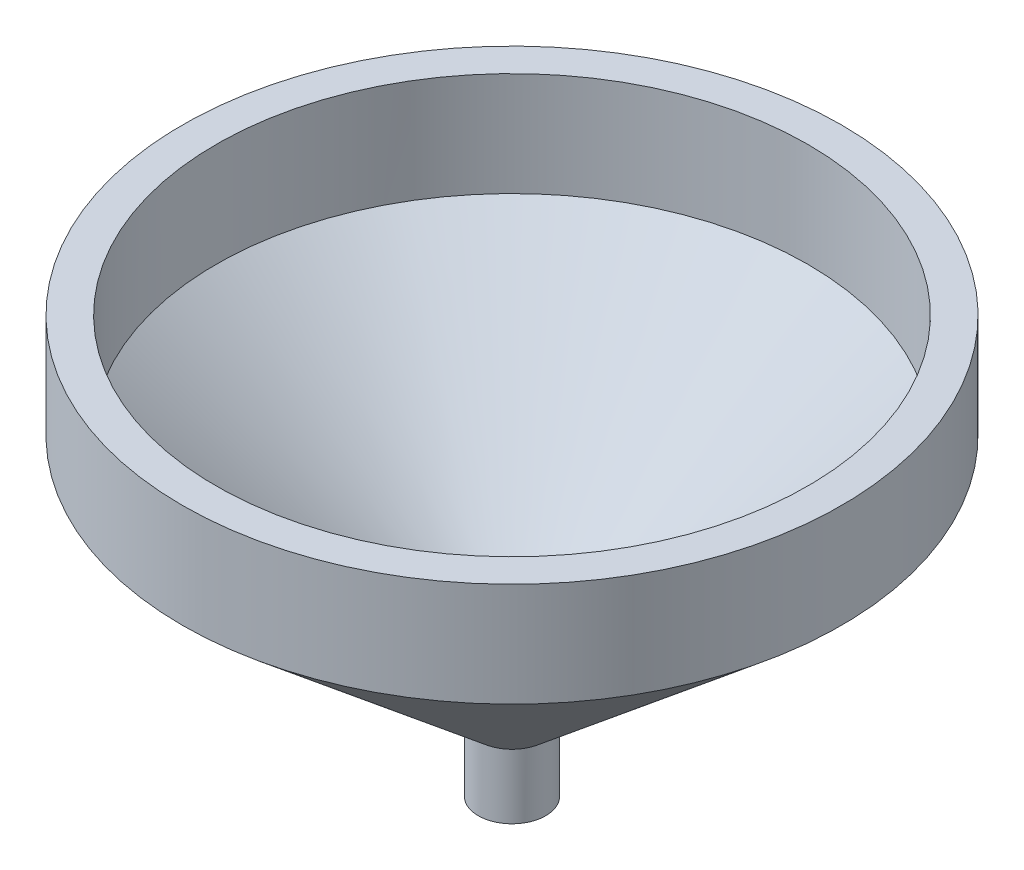
ISO-10303-21;
HEADER;
FILE_DESCRIPTION(('STEP AP214'),'2;1');
FILE_NAME('part.step','',(''),(''),'','','');
FILE_SCHEMA(('AUTOMOTIVE_DESIGN { 1 0 10303 214 1 1 1 1 }'));
ENDSEC;
DATA;
#1=APPLICATION_CONTEXT('core data for automotive mechanical design processes');
#2=APPLICATION_PROTOCOL_DEFINITION('international standard','automotive_design',2000,#1);
#3=PRODUCT_CONTEXT('',#1,'mechanical');
#4=PRODUCT('Part','Part','',(#3));
#5=PRODUCT_RELATED_PRODUCT_CATEGORY('part','',(#4));
#6=PRODUCT_DEFINITION_FORMATION('','',#4);
#7=PRODUCT_DEFINITION_CONTEXT('part definition',#1,'design');
#8=PRODUCT_DEFINITION('design','',#6,#7);
#9=PRODUCT_DEFINITION_SHAPE('','',#8);
#10=(LENGTH_UNIT() NAMED_UNIT(*) SI_UNIT(.MILLI.,.METRE.));
#11=(NAMED_UNIT(*) PLANE_ANGLE_UNIT() SI_UNIT($,.RADIAN.));
#12=(NAMED_UNIT(*) SI_UNIT($,.STERADIAN.) SOLID_ANGLE_UNIT());
#13=UNCERTAINTY_MEASURE_WITH_UNIT(LENGTH_MEASURE(1.E-05),#10,'distance_accuracy_value','');
#14=(GEOMETRIC_REPRESENTATION_CONTEXT(3) GLOBAL_UNCERTAINTY_ASSIGNED_CONTEXT((#13)) GLOBAL_UNIT_ASSIGNED_CONTEXT((#10,
#11,#12)) REPRESENTATION_CONTEXT('',''));
#15=CARTESIAN_POINT('',(0.,0.,0.));
#16=DIRECTION('',(0.,0.,1.));
#17=DIRECTION('',(1.,0.,0.));
#18=AXIS2_PLACEMENT_3D('',#15,#16,#17);
#19=CARTESIAN_POINT('',(0.,0.,-7.48882649091236));
#20=DIRECTION('',(0.,-1.,0.));
#21=DIRECTION('',(0.,0.,-1.));
#22=AXIS2_PLACEMENT_3D('',#19,#20,#21);
#23=PLANE('',#22);
#24=CARTESIAN_POINT('',(0.,0.,-4.));
#25=DIRECTION('',(0.,-1.,0.));
#26=DIRECTION('',(0.,0.,-1.));
#27=AXIS2_PLACEMENT_3D('',#24,#25,#26);
#28=CIRCLE('',#27,3.48882649091236);
#29=CARTESIAN_POINT('',(0.,0.,-7.48882649091236));
#30=VERTEX_POINT('',#29);
#31=EDGE_CURVE('E65',#30,#30,#28,.T.);
#32=ORIENTED_EDGE('',*,*,#31,.T.);
#33=EDGE_LOOP('',(#32));
#34=FACE_BOUND('',#33,.T.);
#35=ADVANCED_FACE('F33',(#34),#23,.T.);
#36=CARTESIAN_POINT('',(0.,32.3984218283769,-4.));
#37=DIRECTION('',(0.,1.,0.));
#38=DIRECTION('',(0.,0.,1.));
#39=AXIS2_PLACEMENT_3D('',#36,#37,#38);
#40=CONICAL_SURFACE('',#39,30.6417777247592,0.872664625997167);
#41=CARTESIAN_POINT('',(0.,6.68691744091537,-4.));
#42=VERTEX_POINT('',#41);
#43=VERTEX_LOOP('',#42);
#44=FACE_BOUND('',#43,.T.);
#45=CARTESIAN_POINT('',(0.,32.3984218283769,-4.));
#46=DIRECTION('',(0.,-1.,0.));
#47=DIRECTION('',(0.,0.,-1.));
#48=AXIS2_PLACEMENT_3D('',#45,#46,#47);
#49=CIRCLE('',#48,30.6417777247592);
#50=CARTESIAN_POINT('',(0.,32.3984218283769,-34.6417777247592));
#51=VERTEX_POINT('',#50);
#52=EDGE_CURVE('E11',#51,#51,#49,.T.);
#53=ORIENTED_EDGE('',*,*,#52,.F.);
#54=EDGE_LOOP('',(#53));
#55=FACE_BOUND('',#54,.T.);
#56=ADVANCED_FACE('F42',(#44,#55),#40,.F.);
#57=CARTESIAN_POINT('',(0.,0.,-4.));
#58=DIRECTION('',(0.,-1.,0.));
#59=DIRECTION('',(0.,0.,-1.));
#60=AXIS2_PLACEMENT_3D('',#57,#58,#59);
#61=CYLINDRICAL_SURFACE('',#60,30.6417777247592);
#62=ORIENTED_EDGE('',*,*,#52,.T.);
#63=EDGE_LOOP('',(#62));
#64=FACE_BOUND('',#63,.T.);
#65=CARTESIAN_POINT('',(0.,43.1556368420233,-4.));
#66=DIRECTION('',(0.,-1.,0.));
#67=DIRECTION('',(0.,0.,-1.));
#68=AXIS2_PLACEMENT_3D('',#65,#66,#67);
#69=CIRCLE('',#68,30.6417777247592);
#70=CARTESIAN_POINT('',(0.,43.1556368420233,-34.6417777247592));
#71=VERTEX_POINT('',#70);
#72=EDGE_CURVE('E39',#71,#71,#69,.T.);
#73=ORIENTED_EDGE('',*,*,#72,.F.);
#74=EDGE_LOOP('',(#73));
#75=FACE_BOUND('',#74,.T.);
#76=ADVANCED_FACE('F45',(#64,#75),#61,.F.);
#77=CARTESIAN_POINT('',(0.,43.1556368420233,-34.6417777247592));
#78=DIRECTION('',(0.,1.,0.));
#79=DIRECTION('',(0.,0.,1.));
#80=AXIS2_PLACEMENT_3D('',#77,#78,#79);
#81=PLANE('',#80);
#82=ORIENTED_EDGE('',*,*,#72,.T.);
#83=EDGE_LOOP('',(#82));
#84=FACE_BOUND('',#83,.T.);
#85=CARTESIAN_POINT('',(0.,43.1556368420233,-4.));
#86=DIRECTION('',(0.,-1.,0.));
#87=DIRECTION('',(0.,0.,-1.));
#88=AXIS2_PLACEMENT_3D('',#85,#86,#87);
#89=CIRCLE('',#88,34.1306042156715);
#90=CARTESIAN_POINT('',(0.,43.1556368420233,-38.1306042156715));
#91=VERTEX_POINT('',#90);
#92=EDGE_CURVE('E55',#91,#91,#89,.T.);
#93=ORIENTED_EDGE('',*,*,#92,.F.);
#94=EDGE_LOOP('',(#93));
#95=FACE_BOUND('',#94,.T.);
#96=ADVANCED_FACE('F50',(#84,#95),#81,.T.);
#97=CARTESIAN_POINT('',(0.,0.,-4.));
#98=DIRECTION('',(0.,-1.,0.));
#99=DIRECTION('',(0.,0.,-1.));
#100=AXIS2_PLACEMENT_3D('',#97,#98,#99);
#101=CYLINDRICAL_SURFACE('',#100,34.1306042156715);
#102=ORIENTED_EDGE('',*,*,#92,.T.);
#103=EDGE_LOOP('',(#102));
#104=FACE_BOUND('',#103,.T.);
#105=CARTESIAN_POINT('',(0.,32.3984218283769,-4.));
#106=DIRECTION('',(0.,-1.,0.));
#107=DIRECTION('',(0.,0.,-1.));
#108=AXIS2_PLACEMENT_3D('',#105,#106,#107);
#109=CIRCLE('',#108,34.1306042156715);
#110=CARTESIAN_POINT('',(0.,32.3984218283769,30.1306042156715));
#111=VERTEX_POINT('',#110);
#112=EDGE_CURVE('E57',#111,#111,#109,.T.);
#113=ORIENTED_EDGE('',*,*,#112,.F.);
#114=EDGE_LOOP('',(#113));
#115=FACE_BOUND('',#114,.T.);
#116=ADVANCED_FACE('F78',(#104,#115),#101,.T.);
#117=CARTESIAN_POINT('',(0.,6.68691744091537,-4.));
#118=DIRECTION('',(0.,1.,0.));
#119=DIRECTION('',(0.,0.,1.));
#120=AXIS2_PLACEMENT_3D('',#117,#118,#119);
#121=CONICAL_SURFACE('',#120,3.48882649091236,0.872664625997166);
#122=CARTESIAN_POINT('',(0.,6.68691744091537,-4.));
#123=DIRECTION('',(0.,-1.,0.));
#124=DIRECTION('',(0.,0.,-1.));
#125=AXIS2_PLACEMENT_3D('',#122,#123,#124);
#126=CIRCLE('',#125,3.48882649091236);
#127=CARTESIAN_POINT('',(0.,6.68691744091538,-0.511173509087637));
#128=VERTEX_POINT('',#127);
#129=EDGE_CURVE('E62',#128,#128,#126,.T.);
#130=CARTESIAN_POINT('',(0.,32.3984218283769,30.1306042156715));
#131=CARTESIAN_POINT('',(0.,32.1305936576742,29.8114190310386));
#132=CARTESIAN_POINT('',(0.,31.8627654869714,29.4922338464057));
#133=CARTESIAN_POINT('',(0.,31.327109145566,28.8538634771399));
#134=CARTESIAN_POINT('',(0.,31.0592809748633,28.534678292507));
#135=CARTESIAN_POINT('',(0.,30.5236246334578,27.8963079232412));
#136=CARTESIAN_POINT('',(0.,30.2557964627551,27.5771227386083));
#137=CARTESIAN_POINT('',(0.,29.7201401213497,26.9387523693424));
#138=CARTESIAN_POINT('',(0.,29.4523119506469,26.6195671847095));
#139=CARTESIAN_POINT('',(0.,28.9166556092415,25.9811968154437));
#140=CARTESIAN_POINT('',(0.,28.6488274385388,25.6620116308108));
#141=CARTESIAN_POINT('',(0.,28.1131710971333,25.023641261545));
#142=CARTESIAN_POINT('',(0.,27.8453429264306,24.7044560769121));
#143=CARTESIAN_POINT('',(0.,27.3096865850251,24.0660857076463));
#144=CARTESIAN_POINT('',(0.,27.0418584143224,23.7469005230134));
#145=CARTESIAN_POINT('',(0.,26.506202072917,23.1085301537475));
#146=CARTESIAN_POINT('',(0.,26.2383739022142,22.7893449691146));
#147=CARTESIAN_POINT('',(0.,25.7027175608088,22.1509745998488));
#148=CARTESIAN_POINT('',(0.,25.4348893901061,21.8317894152159));
#149=CARTESIAN_POINT('',(0.,24.8992330487006,21.1934190459501));
#150=CARTESIAN_POINT('',(0.,24.6314048779979,20.8742338613172));
#151=CARTESIAN_POINT('',(0.,24.0957485365924,20.2358634920514));
#152=CARTESIAN_POINT('',(0.,23.8279203658897,19.9166783074185));
#153=CARTESIAN_POINT('',(0.,23.2922640244843,19.2783079381527));
#154=CARTESIAN_POINT('',(0.,23.0244358537815,18.9591227535197));
#155=CARTESIAN_POINT('',(0.,22.4887795123761,18.3207523842539));
#156=CARTESIAN_POINT('',(0.,22.2209513416734,18.001567199621));
#157=CARTESIAN_POINT('',(0.,21.6852950002679,17.3631968303552));
#158=CARTESIAN_POINT('',(0.,21.4174668295652,17.0440116457223));
#159=CARTESIAN_POINT('',(0.,20.8818104881598,16.4056412764565));
#160=CARTESIAN_POINT('',(0.,20.613982317457,16.0864560918236));
#161=CARTESIAN_POINT('',(0.,20.0783259760516,15.4480857225578));
#162=CARTESIAN_POINT('',(0.,19.8104978053489,15.1289005379248));
#163=CARTESIAN_POINT('',(0.,19.2748414639434,14.490530168659));
#164=CARTESIAN_POINT('',(0.,19.0070132932407,14.1713449840261));
#165=CARTESIAN_POINT('',(0.,18.4713569518352,13.5329746147603));
#166=CARTESIAN_POINT('',(0.,18.2035287811325,13.2137894301274));
#167=CARTESIAN_POINT('',(0.,17.6678724397271,12.5754190608616));
#168=CARTESIAN_POINT('',(0.,17.4000442690243,12.2562338762287));
#169=CARTESIAN_POINT('',(0.,16.8643879276189,11.6178635069629));
#170=CARTESIAN_POINT('',(0.,16.5965597569162,11.29867832233));
#171=CARTESIAN_POINT('',(0.,16.0609034155107,10.6603079530641));
#172=CARTESIAN_POINT('',(0.,15.793075244808,10.3411227684312));
#173=CARTESIAN_POINT('',(0.,15.2574189034025,9.70275239916541));
#174=CARTESIAN_POINT('',(0.,14.9895907326998,9.38356721453251));
#175=CARTESIAN_POINT('',(0.,14.4539343912944,8.74519684526669));
#176=CARTESIAN_POINT('',(0.,14.1861062205917,8.42601166063378));
#177=CARTESIAN_POINT('',(0.,13.6504498791862,7.78764129136797));
#178=CARTESIAN_POINT('',(0.,13.3826217084835,7.46845610673506));
#179=CARTESIAN_POINT('',(0.,12.846965367078,6.83008573746924));
#180=CARTESIAN_POINT('',(0.,12.5791371963753,6.51090055283634));
#181=CARTESIAN_POINT('',(0.,12.0434808549699,5.87253018357052));
#182=CARTESIAN_POINT('',(0.,11.7756526842671,5.55334499893761));
#183=CARTESIAN_POINT('',(0.,11.2399963428617,4.9149746296718));
#184=CARTESIAN_POINT('',(0.,10.972168172159,4.59578944503889));
#185=CARTESIAN_POINT('',(0.,10.4365118307535,3.95741907577307));
#186=CARTESIAN_POINT('',(0.,10.1686836600508,3.63823389114016));
#187=CARTESIAN_POINT('',(0.,9.63302731864534,2.99986352187435));
#188=CARTESIAN_POINT('',(0.,9.36519914794261,2.68067833724144));
#189=CARTESIAN_POINT('',(0.,8.82954280653717,2.04230796797562));
#190=CARTESIAN_POINT('',(0.,8.56171463583444,1.72312278334272));
#191=CARTESIAN_POINT('',(0.,8.02605829442899,1.0847524140769));
#192=CARTESIAN_POINT('',(0.,7.75823012372627,0.765567229443993));
#193=CARTESIAN_POINT('',(0.,7.22257378232082,0.127196860178178));
#194=CARTESIAN_POINT('',(0.,6.9547456116181,-0.19198832445473));
#195=CARTESIAN_POINT('',(0.,6.68691744091537,-0.511173509087638));
#196=B_SPLINE_CURVE_WITH_KNOTS('',3,(#130,#131,#132,#133,#134,#135,#136,#137,#138,#139,#140,
#141,#142,#143,#144,#145,#146,#147,#148,#149,#150,#151,#152,#153,#154,#155,#156,#157,#158,#159,
#160,#161,#162,#163,#164,#165,#166,#167,#168,#169,#170,#171,#172,#173,#174,#175,#176,#177,#178,
#179,#180,#181,#182,#183,#184,#185,#186,#187,#188,#189,#190,#191,#192,#193,#194,#195),
.UNSPECIFIED.,.F.,.F.,(4,2,2,2,2,2,2,2,2,2,2,2,2,2,2,2,2,2,2,2,2,2,2,2,2,2,2,2,2,2,2,2,4),(0.,
1.24999999999999,2.49999999999999,3.74999999999999,4.99999999999999,6.25,7.5,8.75,
9.99999999999999,11.25,12.5,13.75,15.,16.25,17.5,18.75,20.,21.25,22.5,23.75,25.,26.25,27.5,
28.75,30.,31.25,32.5,33.75,35.,36.25,37.5,38.75,40.),.UNSPECIFIED.);
#197=EDGE_CURVE('BSEAM72',#111,#128,#196,.T.);
#198=ORIENTED_EDGE('',*,*,#112,.T.);
#199=ORIENTED_EDGE('',*,*,#129,.F.);
#200=ORIENTED_EDGE('',*,*,#197,.T.);
#201=ORIENTED_EDGE('',*,*,#197,.F.);
#202=EDGE_LOOP('',(#198,#200,#199,#201));
#203=FACE_BOUND('',#202,.T.);
#204=ADVANCED_FACE('F72',(#203),#121,.T.);
#205=CARTESIAN_POINT('',(0.,0.,-4.));
#206=DIRECTION('',(0.,-1.,0.));
#207=DIRECTION('',(0.,0.,-1.));
#208=AXIS2_PLACEMENT_3D('',#205,#206,#207);
#209=CYLINDRICAL_SURFACE('',#208,3.48882649091236);
#210=ORIENTED_EDGE('',*,*,#129,.T.);
#211=EDGE_LOOP('',(#210));
#212=FACE_BOUND('',#211,.T.);
#213=ORIENTED_EDGE('',*,*,#31,.F.);
#214=EDGE_LOOP('',(#213));
#215=FACE_BOUND('',#214,.T.);
#216=ADVANCED_FACE('F70',(#212,#215),#209,.T.);
#217=CLOSED_SHELL('',(#35,#56,#76,#96,#116,#204,#216));
#218=MANIFOLD_SOLID_BREP('B2',#217);
#219=ADVANCED_BREP_SHAPE_REPRESENTATION('',(#18,#218),#14);
#220=SHAPE_DEFINITION_REPRESENTATION(#9,#219);
ENDSEC;
END-ISO-10303-21;
